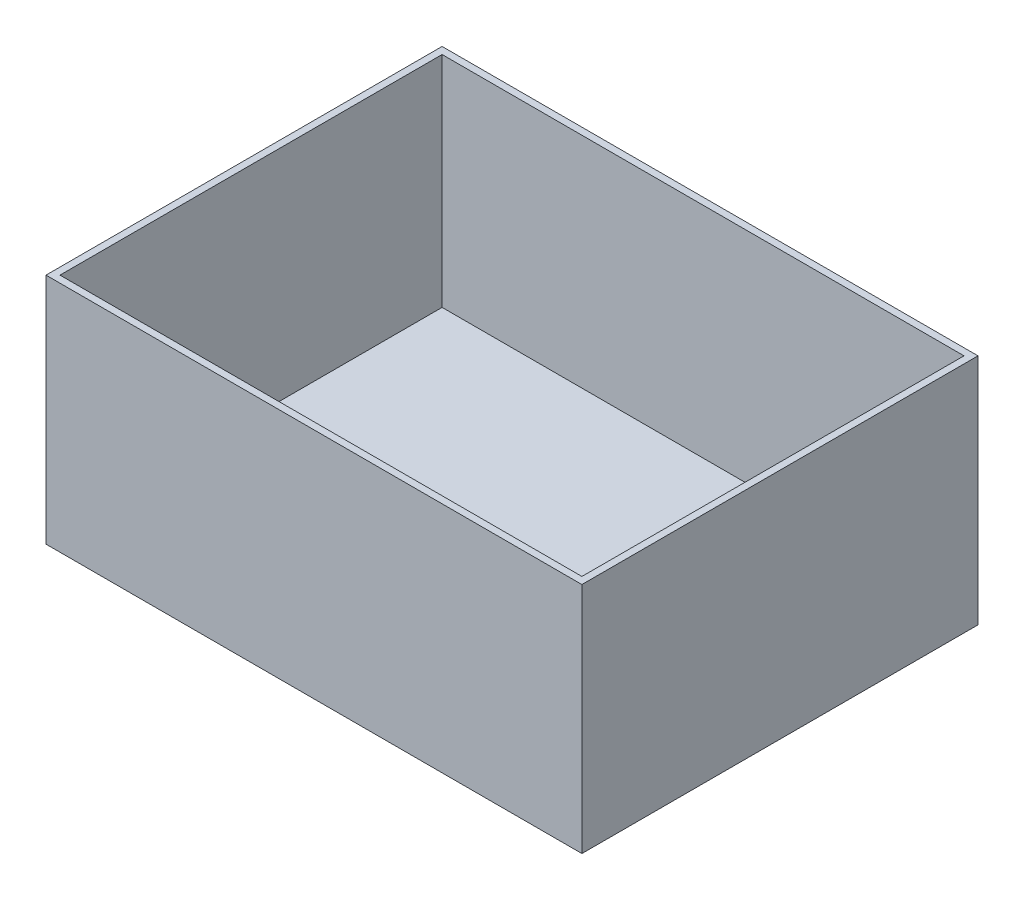
ISO-10303-21;
HEADER;
FILE_DESCRIPTION(('STEP AP214'),'2;1');
FILE_NAME('part.step','',(''),(''),'','','');
FILE_SCHEMA(('AUTOMOTIVE_DESIGN { 1 0 10303 214 1 1 1 1 }'));
ENDSEC;
DATA;
#1=APPLICATION_CONTEXT('core data for automotive mechanical design processes');
#2=APPLICATION_PROTOCOL_DEFINITION('international standard','automotive_design',2000,#1);
#3=PRODUCT_CONTEXT('',#1,'mechanical');
#4=PRODUCT('Part','Part','',(#3));
#5=PRODUCT_RELATED_PRODUCT_CATEGORY('part','',(#4));
#6=PRODUCT_DEFINITION_FORMATION('','',#4);
#7=PRODUCT_DEFINITION_CONTEXT('part definition',#1,'design');
#8=PRODUCT_DEFINITION('design','',#6,#7);
#9=PRODUCT_DEFINITION_SHAPE('','',#8);
#10=(LENGTH_UNIT() NAMED_UNIT(*) SI_UNIT(.MILLI.,.METRE.));
#11=(NAMED_UNIT(*) PLANE_ANGLE_UNIT() SI_UNIT($,.RADIAN.));
#12=(NAMED_UNIT(*) SI_UNIT($,.STERADIAN.) SOLID_ANGLE_UNIT());
#13=UNCERTAINTY_MEASURE_WITH_UNIT(LENGTH_MEASURE(1.E-05),#10,'distance_accuracy_value','');
#14=(GEOMETRIC_REPRESENTATION_CONTEXT(3) GLOBAL_UNCERTAINTY_ASSIGNED_CONTEXT((#13)) GLOBAL_UNIT_ASSIGNED_CONTEXT((#10,
#11,#12)) REPRESENTATION_CONTEXT('',''));
#15=CARTESIAN_POINT('',(0.,0.,0.));
#16=DIRECTION('',(0.,0.,1.));
#17=DIRECTION('',(1.,0.,0.));
#18=AXIS2_PLACEMENT_3D('',#15,#16,#17);
#19=CARTESIAN_POINT('',(115.,50.,170.));
#20=DIRECTION('',(-1.,0.,0.));
#21=DIRECTION('',(0.,0.,1.));
#22=AXIS2_PLACEMENT_3D('',#19,#20,#21);
#23=PLANE('',#22);
#24=DIRECTION('',(0.,1.,0.));
#25=VECTOR('',#24,1.);
#26=CARTESIAN_POINT('',(115.,50.,0.));
#27=LINE('',#26,#25);
#28=CARTESIAN_POINT('',(115.,-50.,0.));
#29=VERTEX_POINT('',#28);
#30=CARTESIAN_POINT('',(115.,50.,0.));
#31=VERTEX_POINT('',#30);
#32=EDGE_CURVE('E143',#29,#31,#27,.T.);
#33=ORIENTED_EDGE('',*,*,#32,.T.);
#34=DIRECTION('',(0.,0.,-1.));
#35=VECTOR('',#34,1.);
#36=CARTESIAN_POINT('',(115.,50.,170.));
#37=LINE('',#36,#35);
#38=CARTESIAN_POINT('',(115.,50.,170.));
#39=VERTEX_POINT('',#38);
#40=EDGE_CURVE('E11',#39,#31,#37,.T.);
#41=ORIENTED_EDGE('',*,*,#40,.F.);
#42=DIRECTION('',(0.,1.,0.));
#43=VECTOR('',#42,1.);
#44=CARTESIAN_POINT('',(115.,50.,170.));
#45=LINE('',#44,#43);
#46=CARTESIAN_POINT('',(115.,-50.,170.));
#47=VERTEX_POINT('',#46);
#48=EDGE_CURVE('E147',#47,#39,#45,.T.);
#49=ORIENTED_EDGE('',*,*,#48,.F.);
#50=DIRECTION('',(0.,0.,-1.));
#51=VECTOR('',#50,1.);
#52=CARTESIAN_POINT('',(115.,-50.,170.));
#53=LINE('',#52,#51);
#54=EDGE_CURVE('E153',#47,#29,#53,.T.);
#55=ORIENTED_EDGE('',*,*,#54,.T.);
#56=EDGE_LOOP('',(#33,#41,#49,#55));
#57=FACE_BOUND('',#56,.T.);
#58=ADVANCED_FACE('F35',(#57),#23,.F.);
#59=CARTESIAN_POINT('',(-115.,50.,170.));
#60=DIRECTION('',(0.,-1.,0.));
#61=DIRECTION('',(0.,0.,-1.));
#62=AXIS2_PLACEMENT_3D('',#59,#60,#61);
#63=PLANE('',#62);
#64=DIRECTION('',(1.,0.,0.));
#65=VECTOR('',#64,1.);
#66=CARTESIAN_POINT('',(112.,50.,167.));
#67=LINE('',#66,#65);
#68=CARTESIAN_POINT('',(-112.,50.,167.));
#69=VERTEX_POINT('',#68);
#70=CARTESIAN_POINT('',(112.,50.,167.));
#71=VERTEX_POINT('',#70);
#72=EDGE_CURVE('E137',#69,#71,#67,.T.);
#73=ORIENTED_EDGE('',*,*,#72,.F.);
#74=DIRECTION('',(0.,0.,1.));
#75=VECTOR('',#74,1.);
#76=CARTESIAN_POINT('',(-112.,50.,167.));
#77=LINE('',#76,#75);
#78=CARTESIAN_POINT('',(-112.,50.,3.00000000000003));
#79=VERTEX_POINT('',#78);
#80=EDGE_CURVE('E49',#79,#69,#77,.T.);
#81=ORIENTED_EDGE('',*,*,#80,.F.);
#82=DIRECTION('',(-1.,0.,0.));
#83=VECTOR('',#82,1.);
#84=CARTESIAN_POINT('',(112.,50.,3.));
#85=LINE('',#84,#83);
#86=CARTESIAN_POINT('',(112.,50.,3.));
#87=VERTEX_POINT('',#86);
#88=EDGE_CURVE('E128',#87,#79,#85,.T.);
#89=ORIENTED_EDGE('',*,*,#88,.F.);
#90=DIRECTION('',(0.,0.,-1.));
#91=VECTOR('',#90,1.);
#92=CARTESIAN_POINT('',(112.,50.,167.));
#93=LINE('',#92,#91);
#94=EDGE_CURVE('E131',#71,#87,#93,.T.);
#95=ORIENTED_EDGE('',*,*,#94,.F.);
#96=EDGE_LOOP('',(#73,#81,#89,#95));
#97=FACE_BOUND('',#96,.T.);
#98=DIRECTION('',(-1.,0.,0.));
#99=VECTOR('',#98,1.);
#100=CARTESIAN_POINT('',(-115.,50.,0.));
#101=LINE('',#100,#99);
#102=CARTESIAN_POINT('',(-115.,50.,0.));
#103=VERTEX_POINT('',#102);
#104=EDGE_CURVE('E156',#31,#103,#101,.T.);
#105=ORIENTED_EDGE('',*,*,#104,.T.);
#106=DIRECTION('',(0.,0.,-1.));
#107=VECTOR('',#106,1.);
#108=CARTESIAN_POINT('',(-115.,50.,170.));
#109=LINE('',#108,#107);
#110=CARTESIAN_POINT('',(-115.,50.,170.));
#111=VERTEX_POINT('',#110);
#112=EDGE_CURVE('E42',#111,#103,#109,.T.);
#113=ORIENTED_EDGE('',*,*,#112,.F.);
#114=DIRECTION('',(-1.,0.,0.));
#115=VECTOR('',#114,1.);
#116=CARTESIAN_POINT('',(-115.,50.,170.));
#117=LINE('',#116,#115);
#118=EDGE_CURVE('E86',#39,#111,#117,.T.);
#119=ORIENTED_EDGE('',*,*,#118,.F.);
#120=ORIENTED_EDGE('',*,*,#40,.T.);
#121=EDGE_LOOP('',(#105,#113,#119,#120));
#122=FACE_BOUND('',#121,.T.);
#123=ADVANCED_FACE('F184',(#97,#122),#63,.F.);
#124=CARTESIAN_POINT('',(-115.,50.,170.));
#125=DIRECTION('',(1.,0.,0.));
#126=DIRECTION('',(0.,0.,-1.));
#127=AXIS2_PLACEMENT_3D('',#124,#125,#126);
#128=PLANE('',#127);
#129=DIRECTION('',(0.,-1.,0.));
#130=VECTOR('',#129,1.);
#131=CARTESIAN_POINT('',(-115.,50.,0.));
#132=LINE('',#131,#130);
#133=CARTESIAN_POINT('',(-115.,-50.,0.));
#134=VERTEX_POINT('',#133);
#135=EDGE_CURVE('E158',#103,#134,#132,.T.);
#136=ORIENTED_EDGE('',*,*,#135,.T.);
#137=DIRECTION('',(0.,0.,-1.));
#138=VECTOR('',#137,1.);
#139=CARTESIAN_POINT('',(-115.,-50.,170.));
#140=LINE('',#139,#138);
#141=CARTESIAN_POINT('',(-115.,-50.,170.));
#142=VERTEX_POINT('',#141);
#143=EDGE_CURVE('E162',#142,#134,#140,.T.);
#144=ORIENTED_EDGE('',*,*,#143,.F.);
#145=DIRECTION('',(0.,-1.,0.));
#146=VECTOR('',#145,1.);
#147=CARTESIAN_POINT('',(-115.,50.,170.));
#148=LINE('',#147,#146);
#149=EDGE_CURVE('E150',#111,#142,#148,.T.);
#150=ORIENTED_EDGE('',*,*,#149,.F.);
#151=ORIENTED_EDGE('',*,*,#112,.T.);
#152=EDGE_LOOP('',(#136,#144,#150,#151));
#153=FACE_BOUND('',#152,.T.);
#154=ADVANCED_FACE('F167',(#153),#128,.F.);
#155=CARTESIAN_POINT('',(-115.,-50.,170.));
#156=DIRECTION('',(0.,1.,0.));
#157=DIRECTION('',(0.,0.,1.));
#158=AXIS2_PLACEMENT_3D('',#155,#156,#157);
#159=PLANE('',#158);
#160=DIRECTION('',(1.,0.,0.));
#161=VECTOR('',#160,1.);
#162=CARTESIAN_POINT('',(-115.,-50.,0.));
#163=LINE('',#162,#161);
#164=EDGE_CURVE('E79',#134,#29,#163,.T.);
#165=ORIENTED_EDGE('',*,*,#164,.T.);
#166=ORIENTED_EDGE('',*,*,#54,.F.);
#167=DIRECTION('',(1.,0.,0.));
#168=VECTOR('',#167,1.);
#169=CARTESIAN_POINT('',(-115.,-50.,170.));
#170=LINE('',#169,#168);
#171=EDGE_CURVE('E58',#142,#47,#170,.T.);
#172=ORIENTED_EDGE('',*,*,#171,.F.);
#173=ORIENTED_EDGE('',*,*,#143,.T.);
#174=EDGE_LOOP('',(#165,#166,#172,#173));
#175=FACE_BOUND('',#174,.T.);
#176=ADVANCED_FACE('F175',(#175),#159,.F.);
#177=CARTESIAN_POINT('',(0.,0.,170.));
#178=DIRECTION('',(0.,0.,1.));
#179=DIRECTION('',(1.,0.,0.));
#180=AXIS2_PLACEMENT_3D('',#177,#178,#179);
#181=PLANE('',#180);
#182=ORIENTED_EDGE('',*,*,#48,.T.);
#183=ORIENTED_EDGE('',*,*,#118,.T.);
#184=ORIENTED_EDGE('',*,*,#149,.T.);
#185=ORIENTED_EDGE('',*,*,#171,.T.);
#186=EDGE_LOOP('',(#182,#183,#184,#185));
#187=FACE_BOUND('',#186,.T.);
#188=ADVANCED_FACE('F177',(#187),#181,.T.);
#189=CARTESIAN_POINT('',(0.,0.,0.));
#190=DIRECTION('',(0.,0.,1.));
#191=DIRECTION('',(1.,0.,0.));
#192=AXIS2_PLACEMENT_3D('',#189,#190,#191);
#193=PLANE('',#192);
#194=ORIENTED_EDGE('',*,*,#32,.F.);
#195=ORIENTED_EDGE('',*,*,#164,.F.);
#196=ORIENTED_EDGE('',*,*,#135,.F.);
#197=ORIENTED_EDGE('',*,*,#104,.F.);
#198=EDGE_LOOP('',(#194,#195,#196,#197));
#199=FACE_BOUND('',#198,.T.);
#200=ADVANCED_FACE('F171',(#199),#193,.F.);
#201=CARTESIAN_POINT('',(-112.,-44.,167.));
#202=DIRECTION('',(-1.,0.,0.));
#203=DIRECTION('',(0.,0.,1.));
#204=AXIS2_PLACEMENT_3D('',#201,#202,#203);
#205=PLANE('',#204);
#206=ORIENTED_EDGE('',*,*,#80,.T.);
#207=DIRECTION('',(0.,1.,0.));
#208=VECTOR('',#207,1.);
#209=CARTESIAN_POINT('',(-112.,-44.,167.));
#210=LINE('',#209,#208);
#211=CARTESIAN_POINT('',(-112.,-44.,167.));
#212=VERTEX_POINT('',#211);
#213=EDGE_CURVE('E106',#212,#69,#210,.T.);
#214=ORIENTED_EDGE('',*,*,#213,.F.);
#215=DIRECTION('',(0.,0.,1.));
#216=VECTOR('',#215,1.);
#217=CARTESIAN_POINT('',(-112.,-44.,167.));
#218=LINE('',#217,#216);
#219=CARTESIAN_POINT('',(-112.,-44.,3.00000000000003));
#220=VERTEX_POINT('',#219);
#221=EDGE_CURVE('E110',#220,#212,#218,.T.);
#222=ORIENTED_EDGE('',*,*,#221,.F.);
#223=DIRECTION('',(0.,1.,0.));
#224=VECTOR('',#223,1.);
#225=CARTESIAN_POINT('',(-112.,-44.,3.00000000000003));
#226=LINE('',#225,#224);
#227=EDGE_CURVE('E141',#220,#79,#226,.T.);
#228=ORIENTED_EDGE('',*,*,#227,.T.);
#229=EDGE_LOOP('',(#206,#214,#222,#228));
#230=FACE_BOUND('',#229,.T.);
#231=ADVANCED_FACE('F108',(#230),#205,.F.);
#232=CARTESIAN_POINT('',(112.,-44.,3.));
#233=DIRECTION('',(0.,0.,-1.));
#234=DIRECTION('',(-1.,0.,0.));
#235=AXIS2_PLACEMENT_3D('',#232,#233,#234);
#236=PLANE('',#235);
#237=ORIENTED_EDGE('',*,*,#88,.T.);
#238=ORIENTED_EDGE('',*,*,#227,.F.);
#239=DIRECTION('',(-1.,0.,0.));
#240=VECTOR('',#239,1.);
#241=CARTESIAN_POINT('',(112.,-44.,3.));
#242=LINE('',#241,#240);
#243=CARTESIAN_POINT('',(112.,-44.,3.));
#244=VERTEX_POINT('',#243);
#245=EDGE_CURVE('E116',#244,#220,#242,.T.);
#246=ORIENTED_EDGE('',*,*,#245,.F.);
#247=DIRECTION('',(0.,1.,0.));
#248=VECTOR('',#247,1.);
#249=CARTESIAN_POINT('',(112.,-44.,3.));
#250=LINE('',#249,#248);
#251=EDGE_CURVE('E144',#244,#87,#250,.T.);
#252=ORIENTED_EDGE('',*,*,#251,.T.);
#253=EDGE_LOOP('',(#237,#238,#246,#252));
#254=FACE_BOUND('',#253,.T.);
#255=ADVANCED_FACE('F199',(#254),#236,.F.);
#256=CARTESIAN_POINT('',(112.,-44.,167.));
#257=DIRECTION('',(1.,0.,0.));
#258=DIRECTION('',(0.,0.,-1.));
#259=AXIS2_PLACEMENT_3D('',#256,#257,#258);
#260=PLANE('',#259);
#261=ORIENTED_EDGE('',*,*,#94,.T.);
#262=ORIENTED_EDGE('',*,*,#251,.F.);
#263=DIRECTION('',(0.,0.,-1.));
#264=VECTOR('',#263,1.);
#265=CARTESIAN_POINT('',(112.,-44.,167.));
#266=LINE('',#265,#264);
#267=CARTESIAN_POINT('',(112.,-44.,167.));
#268=VERTEX_POINT('',#267);
#269=EDGE_CURVE('E124',#268,#244,#266,.T.);
#270=ORIENTED_EDGE('',*,*,#269,.F.);
#271=DIRECTION('',(0.,1.,0.));
#272=VECTOR('',#271,1.);
#273=CARTESIAN_POINT('',(112.,-44.,167.));
#274=LINE('',#273,#272);
#275=EDGE_CURVE('E115',#268,#71,#274,.T.);
#276=ORIENTED_EDGE('',*,*,#275,.T.);
#277=EDGE_LOOP('',(#261,#262,#270,#276));
#278=FACE_BOUND('',#277,.T.);
#279=ADVANCED_FACE('F197',(#278),#260,.F.);
#280=CARTESIAN_POINT('',(112.,-44.,167.));
#281=DIRECTION('',(0.,0.,1.));
#282=DIRECTION('',(1.,0.,0.));
#283=AXIS2_PLACEMENT_3D('',#280,#281,#282);
#284=PLANE('',#283);
#285=ORIENTED_EDGE('',*,*,#72,.T.);
#286=ORIENTED_EDGE('',*,*,#275,.F.);
#287=DIRECTION('',(1.,0.,0.));
#288=VECTOR('',#287,1.);
#289=CARTESIAN_POINT('',(112.,-44.,167.));
#290=LINE('',#289,#288);
#291=EDGE_CURVE('E119',#212,#268,#290,.T.);
#292=ORIENTED_EDGE('',*,*,#291,.F.);
#293=ORIENTED_EDGE('',*,*,#213,.T.);
#294=EDGE_LOOP('',(#285,#286,#292,#293));
#295=FACE_BOUND('',#294,.T.);
#296=ADVANCED_FACE('F120',(#295),#284,.F.);
#297=CARTESIAN_POINT('',(0.,-44.,0.));
#298=DIRECTION('',(0.,1.,0.));
#299=DIRECTION('',(0.,0.,1.));
#300=AXIS2_PLACEMENT_3D('',#297,#298,#299);
#301=PLANE('',#300);
#302=ORIENTED_EDGE('',*,*,#221,.T.);
#303=ORIENTED_EDGE('',*,*,#291,.T.);
#304=ORIENTED_EDGE('',*,*,#269,.T.);
#305=ORIENTED_EDGE('',*,*,#245,.T.);
#306=EDGE_LOOP('',(#302,#303,#304,#305));
#307=FACE_BOUND('',#306,.T.);
#308=ADVANCED_FACE('F126',(#307),#301,.T.);
#309=CLOSED_SHELL('',(#58,#123,#154,#176,#188,#200,#231,#255,#279,#296,#308));
#310=MANIFOLD_SOLID_BREP('B2',#309);
#311=ADVANCED_BREP_SHAPE_REPRESENTATION('',(#18,#310),#14);
#312=SHAPE_DEFINITION_REPRESENTATION(#9,#311);
ENDSEC;
END-ISO-10303-21;
